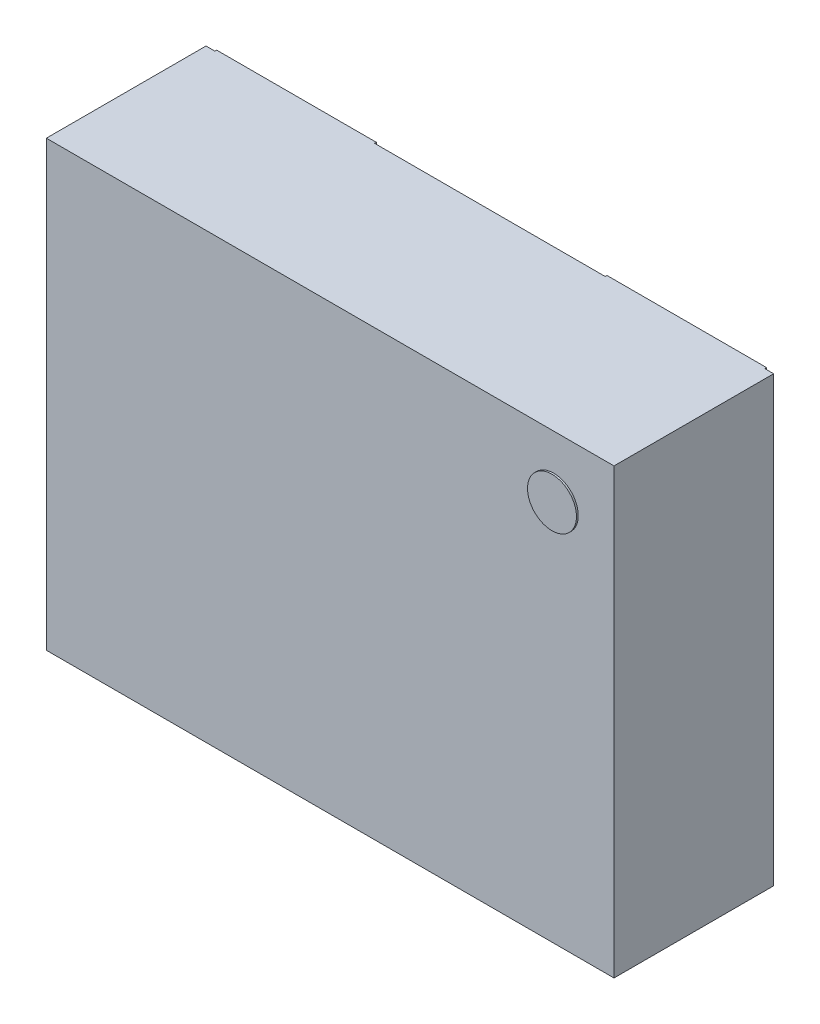
ISO-10303-21;
HEADER;
FILE_DESCRIPTION(('STEP AP214'),'2;1');
FILE_NAME('part.step','',(''),(''),'','','');
FILE_SCHEMA(('AUTOMOTIVE_DESIGN { 1 0 10303 214 1 1 1 1 }'));
ENDSEC;
DATA;
#1=APPLICATION_CONTEXT('core data for automotive mechanical design processes');
#2=APPLICATION_PROTOCOL_DEFINITION('international standard','automotive_design',2000,#1);
#3=PRODUCT_CONTEXT('',#1,'mechanical');
#4=PRODUCT('Part','Part','',(#3));
#5=PRODUCT_RELATED_PRODUCT_CATEGORY('part','',(#4));
#6=PRODUCT_DEFINITION_FORMATION('','',#4);
#7=PRODUCT_DEFINITION_CONTEXT('part definition',#1,'design');
#8=PRODUCT_DEFINITION('design','',#6,#7);
#9=PRODUCT_DEFINITION_SHAPE('','',#8);
#10=(LENGTH_UNIT() NAMED_UNIT(*) SI_UNIT(.MILLI.,.METRE.));
#11=(NAMED_UNIT(*) PLANE_ANGLE_UNIT() SI_UNIT($,.RADIAN.));
#12=(NAMED_UNIT(*) SI_UNIT($,.STERADIAN.) SOLID_ANGLE_UNIT());
#13=UNCERTAINTY_MEASURE_WITH_UNIT(LENGTH_MEASURE(1.E-05),#10,'distance_accuracy_value','');
#14=(GEOMETRIC_REPRESENTATION_CONTEXT(3) GLOBAL_UNCERTAINTY_ASSIGNED_CONTEXT((#13)) GLOBAL_UNIT_ASSIGNED_CONTEXT((#10,
#11,#12)) REPRESENTATION_CONTEXT('',''));
#15=CARTESIAN_POINT('',(0.,0.,0.));
#16=DIRECTION('',(0.,0.,1.));
#17=DIRECTION('',(1.,0.,0.));
#18=AXIS2_PLACEMENT_3D('',#15,#16,#17);
#19=CARTESIAN_POINT('',(7.35489990234375,20.14,-0.01));
#20=DIRECTION('',(0.,-1.,0.));
#21=DIRECTION('',(1.,0.,0.));
#22=AXIS2_PLACEMENT_3D('',#19,#20,#21);
#23=PLANE('',#22);
#24=DIRECTION('',(0.,0.,1.));
#25=VECTOR('',#24,1.);
#26=CARTESIAN_POINT('',(7.35489990234375,20.14,-0.0100000000000001));
#27=LINE('',#26,#25);
#28=CARTESIAN_POINT('',(7.35489990234375,20.14,0.));
#29=VERTEX_POINT('',#28);
#30=CARTESIAN_POINT('',(7.35489990234375,20.14,-0.01));
#31=VERTEX_POINT('',#30);
#32=EDGE_CURVE('E168',#29,#31,#27,.F.);
#33=ORIENTED_EDGE('',*,*,#32,.T.);
#34=DIRECTION('',(1.,0.,0.));
#35=VECTOR('',#34,1.);
#36=CARTESIAN_POINT('',(6.45489990234375,20.14,-0.0100000000000001));
#37=LINE('',#36,#35);
#38=CARTESIAN_POINT('',(6.45489990234375,20.14,-0.0100000000000001));
#39=VERTEX_POINT('',#38);
#40=EDGE_CURVE('E158',#39,#31,#37,.T.);
#41=ORIENTED_EDGE('',*,*,#40,.F.);
#42=DIRECTION('',(0.,0.,1.));
#43=VECTOR('',#42,1.);
#44=CARTESIAN_POINT('',(6.45489990234375,20.14,-0.0100000000000001));
#45=LINE('',#44,#43);
#46=CARTESIAN_POINT('',(6.45489990234375,20.14,0.));
#47=VERTEX_POINT('',#46);
#48=EDGE_CURVE('E181',#39,#47,#45,.T.);
#49=ORIENTED_EDGE('',*,*,#48,.T.);
#50=DIRECTION('',(1.,0.,0.));
#51=VECTOR('',#50,1.);
#52=CARTESIAN_POINT('',(7.40489990234374,20.14,0.));
#53=LINE('',#52,#51);
#54=EDGE_CURVE('E171',#29,#47,#53,.F.);
#55=ORIENTED_EDGE('',*,*,#54,.F.);
#56=EDGE_LOOP('',(#33,#41,#49,#55));
#57=FACE_BOUND('',#56,.T.);
#58=ADVANCED_FACE('F17',(#57),#23,.F.);
#59=CARTESIAN_POINT('',(4.25489990234375,20.14,-0.01));
#60=DIRECTION('',(0.,-1.,0.));
#61=DIRECTION('',(1.,0.,0.));
#62=AXIS2_PLACEMENT_3D('',#59,#60,#61);
#63=PLANE('',#62);
#64=DIRECTION('',(0.,0.,1.));
#65=VECTOR('',#64,1.);
#66=CARTESIAN_POINT('',(5.15489990234375,20.14,-0.0100000000000001));
#67=LINE('',#66,#65);
#68=CARTESIAN_POINT('',(5.15489990234375,20.14,0.));
#69=VERTEX_POINT('',#68);
#70=CARTESIAN_POINT('',(5.15489990234375,20.14,-0.01));
#71=VERTEX_POINT('',#70);
#72=EDGE_CURVE('E264',#69,#71,#67,.F.);
#73=ORIENTED_EDGE('',*,*,#72,.T.);
#74=DIRECTION('',(1.,0.,0.));
#75=VECTOR('',#74,1.);
#76=CARTESIAN_POINT('',(4.25489990234375,20.14,-0.01));
#77=LINE('',#76,#75);
#78=CARTESIAN_POINT('',(4.25489990234375,20.14,-0.01));
#79=VERTEX_POINT('',#78);
#80=EDGE_CURVE('E262',#79,#71,#77,.T.);
#81=ORIENTED_EDGE('',*,*,#80,.F.);
#82=DIRECTION('',(0.,0.,1.));
#83=VECTOR('',#82,1.);
#84=CARTESIAN_POINT('',(4.25489990234375,20.14,-0.0100000000000001));
#85=LINE('',#84,#83);
#86=CARTESIAN_POINT('',(4.25489990234375,20.14,0.));
#87=VERTEX_POINT('',#86);
#88=EDGE_CURVE('E254',#79,#87,#85,.T.);
#89=ORIENTED_EDGE('',*,*,#88,.T.);
#90=DIRECTION('',(1.,0.,0.));
#91=VECTOR('',#90,1.);
#92=CARTESIAN_POINT('',(7.40489990234374,20.14,0.));
#93=LINE('',#92,#91);
#94=EDGE_CURVE('E222',#69,#87,#93,.F.);
#95=ORIENTED_EDGE('',*,*,#94,.F.);
#96=EDGE_LOOP('',(#73,#81,#89,#95));
#97=FACE_BOUND('',#96,.T.);
#98=ADVANCED_FACE('F357',(#97),#63,.F.);
#99=CARTESIAN_POINT('',(4.25489990234375,21.04,-0.00999999999999997));
#100=DIRECTION('',(0.,1.,0.));
#101=DIRECTION('',(-1.,0.,0.));
#102=AXIS2_PLACEMENT_3D('',#99,#100,#101);
#103=PLANE('',#102);
#104=DIRECTION('',(0.,0.,1.));
#105=VECTOR('',#104,1.);
#106=CARTESIAN_POINT('',(4.25489990234375,21.04,-0.00999999999999992));
#107=LINE('',#106,#105);
#108=CARTESIAN_POINT('',(4.25489990234375,21.04,0.));
#109=VERTEX_POINT('',#108);
#110=CARTESIAN_POINT('',(4.25489990234375,21.04,-0.00999999999999997));
#111=VERTEX_POINT('',#110);
#112=EDGE_CURVE('E251',#109,#111,#107,.F.);
#113=ORIENTED_EDGE('',*,*,#112,.T.);
#114=DIRECTION('',(1.,0.,0.));
#115=VECTOR('',#114,1.);
#116=CARTESIAN_POINT('',(5.15489990234375,21.04,-0.00999999999999997));
#117=LINE('',#116,#115);
#118=CARTESIAN_POINT('',(5.15489990234375,21.04,-0.00999999999999996));
#119=VERTEX_POINT('',#118);
#120=EDGE_CURVE('E249',#119,#111,#117,.F.);
#121=ORIENTED_EDGE('',*,*,#120,.F.);
#122=DIRECTION('',(0.,0.,1.));
#123=VECTOR('',#122,1.);
#124=CARTESIAN_POINT('',(5.15489990234375,21.04,-0.00999999999999992));
#125=LINE('',#124,#123);
#126=CARTESIAN_POINT('',(5.15489990234375,21.04,0.));
#127=VERTEX_POINT('',#126);
#128=EDGE_CURVE('E241',#119,#127,#125,.T.);
#129=ORIENTED_EDGE('',*,*,#128,.T.);
#130=DIRECTION('',(1.,0.,0.));
#131=VECTOR('',#130,1.);
#132=CARTESIAN_POINT('',(7.40489990234374,21.04,0.));
#133=LINE('',#132,#131);
#134=EDGE_CURVE('E215',#109,#127,#133,.T.);
#135=ORIENTED_EDGE('',*,*,#134,.F.);
#136=EDGE_LOOP('',(#113,#121,#129,#135));
#137=FACE_BOUND('',#136,.T.);
#138=ADVANCED_FACE('F384',(#137),#103,.F.);
#139=CARTESIAN_POINT('',(6.90489990234375,21.04,-0.00999999999999997));
#140=DIRECTION('',(0.,1.,0.));
#141=DIRECTION('',(0.,0.,1.));
#142=AXIS2_PLACEMENT_3D('',#139,#140,#141);
#143=PLANE('',#142);
#144=DIRECTION('',(0.,0.,1.));
#145=VECTOR('',#144,1.);
#146=CARTESIAN_POINT('',(6.45489990234375,21.04,-0.00999999999999992));
#147=LINE('',#146,#145);
#148=CARTESIAN_POINT('',(6.45489990234375,21.04,0.));
#149=VERTEX_POINT('',#148);
#150=CARTESIAN_POINT('',(6.45489990234375,21.04,-0.00999999999999997));
#151=VERTEX_POINT('',#150);
#152=EDGE_CURVE('E239',#149,#151,#147,.F.);
#153=ORIENTED_EDGE('',*,*,#152,.T.);
#154=DIRECTION('',(1.,0.,0.));
#155=VECTOR('',#154,1.);
#156=CARTESIAN_POINT('',(7.35489990234375,21.04,-0.00999999999999997));
#157=LINE('',#156,#155);
#158=CARTESIAN_POINT('',(6.90489990234375,21.04,-0.00999999999999996));
#159=VERTEX_POINT('',#158);
#160=EDGE_CURVE('E193',#159,#151,#157,.F.);
#161=ORIENTED_EDGE('',*,*,#160,.F.);
#162=DIRECTION('',(0.,0.,1.));
#163=VECTOR('',#162,1.);
#164=CARTESIAN_POINT('',(6.90489990234375,21.04,-0.00999999999999995));
#165=LINE('',#164,#163);
#166=CARTESIAN_POINT('',(6.90489990234375,21.04,0.));
#167=VERTEX_POINT('',#166);
#168=EDGE_CURVE('E174',#159,#167,#165,.T.);
#169=ORIENTED_EDGE('',*,*,#168,.T.);
#170=DIRECTION('',(1.,0.,0.));
#171=VECTOR('',#170,1.);
#172=CARTESIAN_POINT('',(7.40489990234374,21.04,0.));
#173=LINE('',#172,#171);
#174=EDGE_CURVE('E192',#149,#167,#173,.T.);
#175=ORIENTED_EDGE('',*,*,#174,.F.);
#176=EDGE_LOOP('',(#153,#161,#169,#175));
#177=FACE_BOUND('',#176,.T.);
#178=ADVANCED_FACE('F191',(#177),#143,.F.);
#179=CARTESIAN_POINT('',(7.35489990234375,21.44,-0.00999999999999995));
#180=DIRECTION('',(-0.66436383882992,0.74740931868366,0.));
#181=DIRECTION('',(-0.74740931868366,-0.66436383882992,0.));
#182=AXIS2_PLACEMENT_3D('',#179,#180,#181);
#183=PLANE('',#182);
#184=ORIENTED_EDGE('',*,*,#168,.F.);
#185=DIRECTION('',(-0.747409318683659,-0.664363838829921,0.));
#186=VECTOR('',#185,1.);
#187=CARTESIAN_POINT('',(7.35489990234375,21.44,-0.00999999999999995));
#188=LINE('',#187,#186);
#189=CARTESIAN_POINT('',(7.35489990234375,21.44,-0.00999999999999994));
#190=VERTEX_POINT('',#189);
#191=EDGE_CURVE('E237',#190,#159,#188,.T.);
#192=ORIENTED_EDGE('',*,*,#191,.F.);
#193=DIRECTION('',(0.,0.,1.));
#194=VECTOR('',#193,1.);
#195=CARTESIAN_POINT('',(7.35489990234375,21.44,-0.00999999999999992));
#196=LINE('',#195,#194);
#197=CARTESIAN_POINT('',(7.35489990234375,21.44,0.));
#198=VERTEX_POINT('',#197);
#199=EDGE_CURVE('E200',#190,#198,#196,.T.);
#200=ORIENTED_EDGE('',*,*,#199,.T.);
#201=DIRECTION('',(0.747409318683659,0.664363838829921,0.));
#202=VECTOR('',#201,1.);
#203=CARTESIAN_POINT('',(6.90489990234375,21.04,0.));
#204=LINE('',#203,#202);
#205=EDGE_CURVE('E197',#167,#198,#204,.T.);
#206=ORIENTED_EDGE('',*,*,#205,.F.);
#207=EDGE_LOOP('',(#184,#192,#200,#206));
#208=FACE_BOUND('',#207,.T.);
#209=ADVANCED_FACE('F198',(#208),#183,.F.);
#210=CARTESIAN_POINT('',(7.35489990234375,19.34,-0.0100000000000001));
#211=DIRECTION('',(-1.,0.,0.));
#212=DIRECTION('',(0.,-1.,0.));
#213=AXIS2_PLACEMENT_3D('',#210,#211,#212);
#214=PLANE('',#213);
#215=DIRECTION('',(0.,0.,1.));
#216=VECTOR('',#215,1.);
#217=CARTESIAN_POINT('',(7.35489990234375,19.34,0.9));
#218=LINE('',#217,#216);
#219=CARTESIAN_POINT('',(7.35489990234375,19.34,0.));
#220=VERTEX_POINT('',#219);
#221=CARTESIAN_POINT('',(7.35489990234375,19.34,-0.0100000000000001));
#222=VERTEX_POINT('',#221);
#223=EDGE_CURVE('E179',#220,#222,#218,.F.);
#224=ORIENTED_EDGE('',*,*,#223,.T.);
#225=DIRECTION('',(0.,1.,0.));
#226=VECTOR('',#225,1.);
#227=CARTESIAN_POINT('',(7.35489990234375,19.34,-0.0100000000000001));
#228=LINE('',#227,#226);
#229=EDGE_CURVE('E165',#31,#222,#228,.F.);
#230=ORIENTED_EDGE('',*,*,#229,.F.);
#231=ORIENTED_EDGE('',*,*,#32,.F.);
#232=DIRECTION('',(0.,1.,0.));
#233=VECTOR('',#232,1.);
#234=CARTESIAN_POINT('',(7.35489990234375,21.84,0.));
#235=LINE('',#234,#233);
#236=EDGE_CURVE('E205',#220,#29,#235,.T.);
#237=ORIENTED_EDGE('',*,*,#236,.F.);
#238=EDGE_LOOP('',(#224,#230,#231,#237));
#239=FACE_BOUND('',#238,.T.);
#240=ADVANCED_FACE('F177',(#239),#214,.F.);
#241=CARTESIAN_POINT('',(6.45489990234375,19.34,-0.0100000000000001));
#242=DIRECTION('',(0.,0.,-1.));
#243=DIRECTION('',(0.,1.,0.));
#244=AXIS2_PLACEMENT_3D('',#241,#242,#243);
#245=PLANE('',#244);
#246=ORIENTED_EDGE('',*,*,#40,.T.);
#247=ORIENTED_EDGE('',*,*,#229,.T.);
#248=DIRECTION('',(-1.,0.,0.));
#249=VECTOR('',#248,1.);
#250=CARTESIAN_POINT('',(4.20489990234374,19.34,-0.0100000000000001));
#251=LINE('',#250,#249);
#252=CARTESIAN_POINT('',(6.45489990234375,19.34,-0.0100000000000001));
#253=VERTEX_POINT('',#252);
#254=EDGE_CURVE('E287',#222,#253,#251,.T.);
#255=ORIENTED_EDGE('',*,*,#254,.T.);
#256=DIRECTION('',(0.,1.,0.));
#257=VECTOR('',#256,1.);
#258=CARTESIAN_POINT('',(6.45489990234375,19.34,-0.0100000000000001));
#259=LINE('',#258,#257);
#260=EDGE_CURVE('E167',#253,#39,#259,.T.);
#261=ORIENTED_EDGE('',*,*,#260,.T.);
#262=EDGE_LOOP('',(#246,#247,#255,#261));
#263=FACE_BOUND('',#262,.T.);
#264=ADVANCED_FACE('F162',(#263),#245,.T.);
#265=CARTESIAN_POINT('',(6.45489990234375,19.34,-0.0100000000000001));
#266=DIRECTION('',(1.,0.,0.));
#267=DIRECTION('',(0.,1.,0.));
#268=AXIS2_PLACEMENT_3D('',#265,#266,#267);
#269=PLANE('',#268);
#270=ORIENTED_EDGE('',*,*,#48,.F.);
#271=ORIENTED_EDGE('',*,*,#260,.F.);
#272=DIRECTION('',(0.,0.,1.));
#273=VECTOR('',#272,1.);
#274=CARTESIAN_POINT('',(6.45489990234375,19.34,0.9));
#275=LINE('',#274,#273);
#276=CARTESIAN_POINT('',(6.45489990234375,19.34,0.));
#277=VERTEX_POINT('',#276);
#278=EDGE_CURVE('E271',#253,#277,#275,.T.);
#279=ORIENTED_EDGE('',*,*,#278,.T.);
#280=DIRECTION('',(0.,1.,0.));
#281=VECTOR('',#280,1.);
#282=CARTESIAN_POINT('',(6.45489990234375,21.84,0.));
#283=LINE('',#282,#281);
#284=EDGE_CURVE('E227',#47,#277,#283,.F.);
#285=ORIENTED_EDGE('',*,*,#284,.F.);
#286=EDGE_LOOP('',(#270,#271,#279,#285));
#287=FACE_BOUND('',#286,.T.);
#288=ADVANCED_FACE('F269',(#287),#269,.F.);
#289=CARTESIAN_POINT('',(5.15489990234375,19.34,-0.0100000000000001));
#290=DIRECTION('',(-1.,0.,0.));
#291=DIRECTION('',(0.,-1.,0.));
#292=AXIS2_PLACEMENT_3D('',#289,#290,#291);
#293=PLANE('',#292);
#294=DIRECTION('',(0.,0.,1.));
#295=VECTOR('',#294,1.);
#296=CARTESIAN_POINT('',(5.15489990234375,19.34,0.9));
#297=LINE('',#296,#295);
#298=CARTESIAN_POINT('',(5.15489990234375,19.34,0.));
#299=VERTEX_POINT('',#298);
#300=CARTESIAN_POINT('',(5.15489990234375,19.34,-0.01));
#301=VERTEX_POINT('',#300);
#302=EDGE_CURVE('E283',#299,#301,#297,.F.);
#303=ORIENTED_EDGE('',*,*,#302,.T.);
#304=DIRECTION('',(0.,1.,0.));
#305=VECTOR('',#304,1.);
#306=CARTESIAN_POINT('',(5.15489990234375,20.14,-0.01));
#307=LINE('',#306,#305);
#308=EDGE_CURVE('E260',#71,#301,#307,.F.);
#309=ORIENTED_EDGE('',*,*,#308,.F.);
#310=ORIENTED_EDGE('',*,*,#72,.F.);
#311=DIRECTION('',(0.,1.,0.));
#312=VECTOR('',#311,1.);
#313=CARTESIAN_POINT('',(5.15489990234375,21.84,0.));
#314=LINE('',#313,#312);
#315=EDGE_CURVE('E224',#299,#69,#314,.T.);
#316=ORIENTED_EDGE('',*,*,#315,.F.);
#317=EDGE_LOOP('',(#303,#309,#310,#316));
#318=FACE_BOUND('',#317,.T.);
#319=ADVANCED_FACE('F354',(#318),#293,.F.);
#320=CARTESIAN_POINT('',(4.25489990234375,20.14,-0.01));
#321=DIRECTION('',(0.,0.,-1.));
#322=DIRECTION('',(0.,1.,0.));
#323=AXIS2_PLACEMENT_3D('',#320,#321,#322);
#324=PLANE('',#323);
#325=ORIENTED_EDGE('',*,*,#308,.T.);
#326=DIRECTION('',(-1.,0.,0.));
#327=VECTOR('',#326,1.);
#328=CARTESIAN_POINT('',(4.20489990234374,19.34,-0.0100000000000001));
#329=LINE('',#328,#327);
#330=CARTESIAN_POINT('',(4.25489990234375,19.34,-0.0100000000000001));
#331=VERTEX_POINT('',#330);
#332=EDGE_CURVE('E285',#301,#331,#329,.T.);
#333=ORIENTED_EDGE('',*,*,#332,.T.);
#334=DIRECTION('',(0.,1.,0.));
#335=VECTOR('',#334,1.);
#336=CARTESIAN_POINT('',(4.25489990234375,19.34,-0.0100000000000001));
#337=LINE('',#336,#335);
#338=EDGE_CURVE('E257',#331,#79,#337,.T.);
#339=ORIENTED_EDGE('',*,*,#338,.T.);
#340=ORIENTED_EDGE('',*,*,#80,.T.);
#341=EDGE_LOOP('',(#325,#333,#339,#340));
#342=FACE_BOUND('',#341,.T.);
#343=ADVANCED_FACE('F350',(#342),#324,.T.);
#344=CARTESIAN_POINT('',(4.25489990234375,19.34,-0.0100000000000001));
#345=DIRECTION('',(1.,0.,0.));
#346=DIRECTION('',(0.,1.,0.));
#347=AXIS2_PLACEMENT_3D('',#344,#345,#346);
#348=PLANE('',#347);
#349=ORIENTED_EDGE('',*,*,#88,.F.);
#350=ORIENTED_EDGE('',*,*,#338,.F.);
#351=DIRECTION('',(0.,0.,1.));
#352=VECTOR('',#351,1.);
#353=CARTESIAN_POINT('',(4.25489990234375,19.34,0.9));
#354=LINE('',#353,#352);
#355=CARTESIAN_POINT('',(4.25489990234375,19.34,0.));
#356=VERTEX_POINT('',#355);
#357=EDGE_CURVE('E346',#331,#356,#354,.T.);
#358=ORIENTED_EDGE('',*,*,#357,.T.);
#359=DIRECTION('',(0.,1.,0.));
#360=VECTOR('',#359,1.);
#361=CARTESIAN_POINT('',(4.25489990234375,21.84,0.));
#362=LINE('',#361,#360);
#363=EDGE_CURVE('E220',#87,#356,#362,.F.);
#364=ORIENTED_EDGE('',*,*,#363,.F.);
#365=EDGE_LOOP('',(#349,#350,#358,#364));
#366=FACE_BOUND('',#365,.T.);
#367=ADVANCED_FACE('F361',(#366),#348,.F.);
#368=CARTESIAN_POINT('',(4.25489990234375,21.84,-0.00999999999999992));
#369=DIRECTION('',(1.,0.,0.));
#370=DIRECTION('',(0.,1.,0.));
#371=AXIS2_PLACEMENT_3D('',#368,#369,#370);
#372=PLANE('',#371);
#373=DIRECTION('',(0.,0.,1.));
#374=VECTOR('',#373,1.);
#375=CARTESIAN_POINT('',(4.25489990234375,21.84,0.9));
#376=LINE('',#375,#374);
#377=CARTESIAN_POINT('',(4.25489990234375,21.84,0.));
#378=VERTEX_POINT('',#377);
#379=CARTESIAN_POINT('',(4.25489990234375,21.84,-0.00999999999999994));
#380=VERTEX_POINT('',#379);
#381=EDGE_CURVE('E330',#378,#380,#376,.F.);
#382=ORIENTED_EDGE('',*,*,#381,.T.);
#383=DIRECTION('',(0.,1.,0.));
#384=VECTOR('',#383,1.);
#385=CARTESIAN_POINT('',(4.25489990234375,21.84,-0.00999999999999992));
#386=LINE('',#385,#384);
#387=EDGE_CURVE('E247',#111,#380,#386,.T.);
#388=ORIENTED_EDGE('',*,*,#387,.F.);
#389=ORIENTED_EDGE('',*,*,#112,.F.);
#390=DIRECTION('',(0.,1.,0.));
#391=VECTOR('',#390,1.);
#392=CARTESIAN_POINT('',(4.25489990234375,21.84,0.));
#393=LINE('',#392,#391);
#394=EDGE_CURVE('E217',#378,#109,#393,.F.);
#395=ORIENTED_EDGE('',*,*,#394,.F.);
#396=EDGE_LOOP('',(#382,#388,#389,#395));
#397=FACE_BOUND('',#396,.T.);
#398=ADVANCED_FACE('F572',(#397),#372,.F.);
#399=CARTESIAN_POINT('',(5.15489990234375,21.84,-0.00999999999999992));
#400=DIRECTION('',(0.,0.,-1.));
#401=DIRECTION('',(0.,1.,0.));
#402=AXIS2_PLACEMENT_3D('',#399,#400,#401);
#403=PLANE('',#402);
#404=ORIENTED_EDGE('',*,*,#120,.T.);
#405=ORIENTED_EDGE('',*,*,#387,.T.);
#406=DIRECTION('',(1.,0.,0.));
#407=VECTOR('',#406,1.);
#408=CARTESIAN_POINT('',(4.20489990234374,21.84,-0.00999999999999992));
#409=LINE('',#408,#407);
#410=CARTESIAN_POINT('',(5.15489990234375,21.84,-0.00999999999999992));
#411=VERTEX_POINT('',#410);
#412=EDGE_CURVE('E327',#380,#411,#409,.T.);
#413=ORIENTED_EDGE('',*,*,#412,.T.);
#414=DIRECTION('',(0.,-1.,0.));
#415=VECTOR('',#414,1.);
#416=CARTESIAN_POINT('',(5.15489990234375,21.84,-0.00999999999999992));
#417=LINE('',#416,#415);
#418=EDGE_CURVE('E244',#411,#119,#417,.T.);
#419=ORIENTED_EDGE('',*,*,#418,.T.);
#420=EDGE_LOOP('',(#404,#405,#413,#419));
#421=FACE_BOUND('',#420,.T.);
#422=ADVANCED_FACE('F582',(#421),#403,.T.);
#423=CARTESIAN_POINT('',(5.15489990234375,21.84,-0.00999999999999992));
#424=DIRECTION('',(-1.,0.,0.));
#425=DIRECTION('',(0.,-1.,0.));
#426=AXIS2_PLACEMENT_3D('',#423,#424,#425);
#427=PLANE('',#426);
#428=ORIENTED_EDGE('',*,*,#128,.F.);
#429=ORIENTED_EDGE('',*,*,#418,.F.);
#430=DIRECTION('',(0.,0.,1.));
#431=VECTOR('',#430,1.);
#432=CARTESIAN_POINT('',(5.15489990234375,21.84,0.9));
#433=LINE('',#432,#431);
#434=CARTESIAN_POINT('',(5.15489990234375,21.84,0.));
#435=VERTEX_POINT('',#434);
#436=EDGE_CURVE('E324',#411,#435,#433,.T.);
#437=ORIENTED_EDGE('',*,*,#436,.T.);
#438=DIRECTION('',(0.,1.,0.));
#439=VECTOR('',#438,1.);
#440=CARTESIAN_POINT('',(5.15489990234375,21.84,0.));
#441=LINE('',#440,#439);
#442=EDGE_CURVE('E213',#127,#435,#441,.T.);
#443=ORIENTED_EDGE('',*,*,#442,.F.);
#444=EDGE_LOOP('',(#428,#429,#437,#443));
#445=FACE_BOUND('',#444,.T.);
#446=ADVANCED_FACE('F389',(#445),#427,.F.);
#447=CARTESIAN_POINT('',(6.45489990234375,21.84,-0.00999999999999992));
#448=DIRECTION('',(1.,0.,0.));
#449=DIRECTION('',(0.,1.,0.));
#450=AXIS2_PLACEMENT_3D('',#447,#448,#449);
#451=PLANE('',#450);
#452=DIRECTION('',(0.,0.,1.));
#453=VECTOR('',#452,1.);
#454=CARTESIAN_POINT('',(6.45489990234375,21.84,0.9));
#455=LINE('',#454,#453);
#456=CARTESIAN_POINT('',(6.45489990234375,21.84,0.));
#457=VERTEX_POINT('',#456);
#458=CARTESIAN_POINT('',(6.45489990234375,21.84,-0.00999999999999994));
#459=VERTEX_POINT('',#458);
#460=EDGE_CURVE('E318',#457,#459,#455,.F.);
#461=ORIENTED_EDGE('',*,*,#460,.T.);
#462=DIRECTION('',(0.,1.,0.));
#463=VECTOR('',#462,1.);
#464=CARTESIAN_POINT('',(6.45489990234375,21.04,-0.00999999999999997));
#465=LINE('',#464,#463);
#466=EDGE_CURVE('E234',#151,#459,#465,.T.);
#467=ORIENTED_EDGE('',*,*,#466,.F.);
#468=ORIENTED_EDGE('',*,*,#152,.F.);
#469=DIRECTION('',(0.,1.,0.));
#470=VECTOR('',#469,1.);
#471=CARTESIAN_POINT('',(6.45489990234375,21.84,0.));
#472=LINE('',#471,#470);
#473=EDGE_CURVE('E207',#457,#149,#472,.F.);
#474=ORIENTED_EDGE('',*,*,#473,.F.);
#475=EDGE_LOOP('',(#461,#467,#468,#474));
#476=FACE_BOUND('',#475,.T.);
#477=ADVANCED_FACE('F396',(#476),#451,.F.);
#478=CARTESIAN_POINT('',(7.35489990234375,21.04,-0.00999999999999997));
#479=DIRECTION('',(0.,0.,-1.));
#480=DIRECTION('',(0.,1.,0.));
#481=AXIS2_PLACEMENT_3D('',#478,#479,#480);
#482=PLANE('',#481);
#483=ORIENTED_EDGE('',*,*,#466,.T.);
#484=DIRECTION('',(1.,0.,0.));
#485=VECTOR('',#484,1.);
#486=CARTESIAN_POINT('',(4.20489990234374,21.84,-0.00999999999999992));
#487=LINE('',#486,#485);
#488=CARTESIAN_POINT('',(7.35489990234375,21.84,-0.00999999999999992));
#489=VERTEX_POINT('',#488);
#490=EDGE_CURVE('E315',#459,#489,#487,.T.);
#491=ORIENTED_EDGE('',*,*,#490,.T.);
#492=DIRECTION('',(0.,-1.,0.));
#493=VECTOR('',#492,1.);
#494=CARTESIAN_POINT('',(7.35489990234375,21.84,-0.00999999999999992));
#495=LINE('',#494,#493);
#496=EDGE_CURVE('E231',#489,#190,#495,.T.);
#497=ORIENTED_EDGE('',*,*,#496,.T.);
#498=ORIENTED_EDGE('',*,*,#191,.T.);
#499=ORIENTED_EDGE('',*,*,#160,.T.);
#500=EDGE_LOOP('',(#483,#491,#497,#498,#499));
#501=FACE_BOUND('',#500,.T.);
#502=ADVANCED_FACE('F398',(#501),#482,.T.);
#503=CARTESIAN_POINT('',(7.35489990234375,21.84,-0.00999999999999992));
#504=DIRECTION('',(-1.,0.,0.));
#505=DIRECTION('',(0.,-1.,0.));
#506=AXIS2_PLACEMENT_3D('',#503,#504,#505);
#507=PLANE('',#506);
#508=ORIENTED_EDGE('',*,*,#199,.F.);
#509=ORIENTED_EDGE('',*,*,#496,.F.);
#510=DIRECTION('',(0.,0.,1.));
#511=VECTOR('',#510,1.);
#512=CARTESIAN_POINT('',(7.35489990234375,21.84,0.9));
#513=LINE('',#512,#511);
#514=CARTESIAN_POINT('',(7.35489990234375,21.84,0.));
#515=VERTEX_POINT('',#514);
#516=EDGE_CURVE('E312',#489,#515,#513,.T.);
#517=ORIENTED_EDGE('',*,*,#516,.T.);
#518=DIRECTION('',(0.,1.,0.));
#519=VECTOR('',#518,1.);
#520=CARTESIAN_POINT('',(7.35489990234375,21.84,0.));
#521=LINE('',#520,#519);
#522=EDGE_CURVE('E203',#198,#515,#521,.T.);
#523=ORIENTED_EDGE('',*,*,#522,.F.);
#524=EDGE_LOOP('',(#508,#509,#517,#523));
#525=FACE_BOUND('',#524,.T.);
#526=ADVANCED_FACE('F400',(#525),#507,.F.);
#527=CARTESIAN_POINT('',(7.40489990234374,21.84,0.));
#528=DIRECTION('',(0.,0.,-1.));
#529=DIRECTION('',(0.,1.,0.));
#530=AXIS2_PLACEMENT_3D('',#527,#528,#529);
#531=PLANE('',#530);
#532=DIRECTION('',(-1.,0.,0.));
#533=VECTOR('',#532,1.);
#534=CARTESIAN_POINT('',(4.20489990234374,19.34,0.));
#535=LINE('',#534,#533);
#536=CARTESIAN_POINT('',(7.40489990234374,19.34,0.));
#537=VERTEX_POINT('',#536);
#538=EDGE_CURVE('E293',#537,#220,#535,.T.);
#539=ORIENTED_EDGE('',*,*,#538,.T.);
#540=ORIENTED_EDGE('',*,*,#236,.T.);
#541=ORIENTED_EDGE('',*,*,#54,.T.);
#542=ORIENTED_EDGE('',*,*,#284,.T.);
#543=DIRECTION('',(-1.,0.,0.));
#544=VECTOR('',#543,1.);
#545=CARTESIAN_POINT('',(4.20489990234374,19.34,0.));
#546=LINE('',#545,#544);
#547=EDGE_CURVE('E276',#277,#299,#546,.T.);
#548=ORIENTED_EDGE('',*,*,#547,.T.);
#549=ORIENTED_EDGE('',*,*,#315,.T.);
#550=ORIENTED_EDGE('',*,*,#94,.T.);
#551=ORIENTED_EDGE('',*,*,#363,.T.);
#552=DIRECTION('',(-1.,0.,0.));
#553=VECTOR('',#552,1.);
#554=CARTESIAN_POINT('',(4.20489990234374,19.34,0.));
#555=LINE('',#554,#553);
#556=CARTESIAN_POINT('',(4.20489990234374,19.34,0.));
#557=VERTEX_POINT('',#556);
#558=EDGE_CURVE('E344',#356,#557,#555,.T.);
#559=ORIENTED_EDGE('',*,*,#558,.T.);
#560=DIRECTION('',(0.,1.,0.));
#561=VECTOR('',#560,1.);
#562=CARTESIAN_POINT('',(4.20489990234374,19.34,0.));
#563=LINE('',#562,#561);
#564=CARTESIAN_POINT('',(4.20489990234374,21.84,0.));
#565=VERTEX_POINT('',#564);
#566=EDGE_CURVE('E339',#557,#565,#563,.T.);
#567=ORIENTED_EDGE('',*,*,#566,.T.);
#568=DIRECTION('',(1.,0.,0.));
#569=VECTOR('',#568,1.);
#570=CARTESIAN_POINT('',(4.20489990234374,21.84,0.));
#571=LINE('',#570,#569);
#572=EDGE_CURVE('E333',#565,#378,#571,.T.);
#573=ORIENTED_EDGE('',*,*,#572,.T.);
#574=ORIENTED_EDGE('',*,*,#394,.T.);
#575=ORIENTED_EDGE('',*,*,#134,.T.);
#576=ORIENTED_EDGE('',*,*,#442,.T.);
#577=DIRECTION('',(1.,0.,0.));
#578=VECTOR('',#577,1.);
#579=CARTESIAN_POINT('',(4.20489990234374,21.84,0.));
#580=LINE('',#579,#578);
#581=EDGE_CURVE('E321',#435,#457,#580,.T.);
#582=ORIENTED_EDGE('',*,*,#581,.T.);
#583=ORIENTED_EDGE('',*,*,#473,.T.);
#584=ORIENTED_EDGE('',*,*,#174,.T.);
#585=ORIENTED_EDGE('',*,*,#205,.T.);
#586=ORIENTED_EDGE('',*,*,#522,.T.);
#587=DIRECTION('',(1.,0.,0.));
#588=VECTOR('',#587,1.);
#589=CARTESIAN_POINT('',(4.20489990234374,21.84,0.));
#590=LINE('',#589,#588);
#591=CARTESIAN_POINT('',(7.40489990234374,21.84,0.));
#592=VERTEX_POINT('',#591);
#593=EDGE_CURVE('E301',#515,#592,#590,.T.);
#594=ORIENTED_EDGE('',*,*,#593,.T.);
#595=DIRECTION('',(0.,-1.,0.));
#596=VECTOR('',#595,1.);
#597=CARTESIAN_POINT('',(7.40489990234374,19.34,0.));
#598=LINE('',#597,#596);
#599=EDGE_CURVE('E300',#592,#537,#598,.T.);
#600=ORIENTED_EDGE('',*,*,#599,.T.);
#601=EDGE_LOOP('',(#539,#540,#541,#542,#548,#549,#550,#551,#559,#567,#573,#574,#575,#576,#582,
#583,#584,#585,#586,#594,#600));
#602=FACE_BOUND('',#601,.T.);
#603=ADVANCED_FACE('F275',(#602),#531,.T.);
#604=CARTESIAN_POINT('',(7.06534117888643,21.4966894023846,0.91));
#605=DIRECTION('',(0.,0.,1.));
#606=DIRECTION('',(0.,-1.,0.));
#607=AXIS2_PLACEMENT_3D('',#604,#605,#606);
#608=PLANE('',#607);
#609=CARTESIAN_POINT('',(7.06534117888643,21.4966894023846,0.91));
#610=DIRECTION('',(0.,0.,1.));
#611=DIRECTION('',(0.,-1.,0.));
#612=AXIS2_PLACEMENT_3D('',#609,#610,#611);
#613=CIRCLE('',#612,0.137986424036285);
#614=CARTESIAN_POINT('',(7.06534117888643,21.3587029783483,0.91));
#615=VERTEX_POINT('',#614);
#616=EDGE_CURVE('E20',#615,#615,#613,.F.);
#617=ORIENTED_EDGE('',*,*,#616,.F.);
#618=EDGE_LOOP('',(#617));
#619=FACE_BOUND('',#618,.T.);
#620=ADVANCED_FACE('F408',(#619),#608,.T.);
#621=CARTESIAN_POINT('',(4.20489990234374,19.34,0.9));
#622=DIRECTION('',(0.,1.,0.));
#623=DIRECTION('',(-1.,0.,0.));
#624=AXIS2_PLACEMENT_3D('',#621,#622,#623);
#625=PLANE('',#624);
#626=ORIENTED_EDGE('',*,*,#357,.F.);
#627=ORIENTED_EDGE('',*,*,#332,.F.);
#628=ORIENTED_EDGE('',*,*,#302,.F.);
#629=ORIENTED_EDGE('',*,*,#547,.F.);
#630=ORIENTED_EDGE('',*,*,#278,.F.);
#631=ORIENTED_EDGE('',*,*,#254,.F.);
#632=ORIENTED_EDGE('',*,*,#223,.F.);
#633=ORIENTED_EDGE('',*,*,#538,.F.);
#634=DIRECTION('',(0.,0.,1.));
#635=VECTOR('',#634,1.);
#636=CARTESIAN_POINT('',(7.40489990234374,19.34,0.9));
#637=LINE('',#636,#635);
#638=CARTESIAN_POINT('',(7.40489990234374,19.34,0.9));
#639=VERTEX_POINT('',#638);
#640=EDGE_CURVE('E298',#537,#639,#637,.T.);
#641=ORIENTED_EDGE('',*,*,#640,.T.);
#642=DIRECTION('',(1.,0.,0.));
#643=VECTOR('',#642,1.);
#644=CARTESIAN_POINT('',(7.40489990234374,19.34,0.9));
#645=LINE('',#644,#643);
#646=CARTESIAN_POINT('',(4.20489990234374,19.34,0.9));
#647=VERTEX_POINT('',#646);
#648=EDGE_CURVE('E306',#639,#647,#645,.F.);
#649=ORIENTED_EDGE('',*,*,#648,.T.);
#650=DIRECTION('',(0.,0.,1.));
#651=VECTOR('',#650,1.);
#652=CARTESIAN_POINT('',(4.20489990234374,19.34,0.9));
#653=LINE('',#652,#651);
#654=EDGE_CURVE('E341',#647,#557,#653,.F.);
#655=ORIENTED_EDGE('',*,*,#654,.T.);
#656=ORIENTED_EDGE('',*,*,#558,.F.);
#657=EDGE_LOOP('',(#626,#627,#628,#629,#630,#631,#632,#633,#641,#649,#655,#656));
#658=FACE_BOUND('',#657,.T.);
#659=ADVANCED_FACE('F280',(#658),#625,.F.);
#660=CARTESIAN_POINT('',(4.20489990234374,19.34,0.9));
#661=DIRECTION('',(1.,0.,0.));
#662=DIRECTION('',(0.,1.,0.));
#663=AXIS2_PLACEMENT_3D('',#660,#661,#662);
#664=PLANE('',#663);
#665=ORIENTED_EDGE('',*,*,#654,.F.);
#666=DIRECTION('',(0.,1.,0.));
#667=VECTOR('',#666,1.);
#668=CARTESIAN_POINT('',(4.20489990234374,21.84,0.9));
#669=LINE('',#668,#667);
#670=CARTESIAN_POINT('',(4.20489990234374,21.84,0.9));
#671=VERTEX_POINT('',#670);
#672=EDGE_CURVE('E367',#647,#671,#669,.T.);
#673=ORIENTED_EDGE('',*,*,#672,.T.);
#674=DIRECTION('',(0.,0.,1.));
#675=VECTOR('',#674,1.);
#676=CARTESIAN_POINT('',(4.20489990234374,21.84,0.9));
#677=LINE('',#676,#675);
#678=EDGE_CURVE('E336',#671,#565,#677,.F.);
#679=ORIENTED_EDGE('',*,*,#678,.T.);
#680=ORIENTED_EDGE('',*,*,#566,.F.);
#681=EDGE_LOOP('',(#665,#673,#679,#680));
#682=FACE_BOUND('',#681,.T.);
#683=ADVANCED_FACE('F366',(#682),#664,.F.);
#684=CARTESIAN_POINT('',(4.20489990234374,21.84,0.9));
#685=DIRECTION('',(0.,-1.,0.));
#686=DIRECTION('',(1.,0.,0.));
#687=AXIS2_PLACEMENT_3D('',#684,#685,#686);
#688=PLANE('',#687);
#689=ORIENTED_EDGE('',*,*,#516,.F.);
#690=ORIENTED_EDGE('',*,*,#490,.F.);
#691=ORIENTED_EDGE('',*,*,#460,.F.);
#692=ORIENTED_EDGE('',*,*,#581,.F.);
#693=ORIENTED_EDGE('',*,*,#436,.F.);
#694=ORIENTED_EDGE('',*,*,#412,.F.);
#695=ORIENTED_EDGE('',*,*,#381,.F.);
#696=ORIENTED_EDGE('',*,*,#572,.F.);
#697=ORIENTED_EDGE('',*,*,#678,.F.);
#698=DIRECTION('',(1.,0.,0.));
#699=VECTOR('',#698,1.);
#700=CARTESIAN_POINT('',(7.40489990234374,21.84,0.9));
#701=LINE('',#700,#699);
#702=CARTESIAN_POINT('',(7.40489990234374,21.84,0.9));
#703=VERTEX_POINT('',#702);
#704=EDGE_CURVE('E372',#671,#703,#701,.T.);
#705=ORIENTED_EDGE('',*,*,#704,.T.);
#706=DIRECTION('',(0.,0.,1.));
#707=VECTOR('',#706,1.);
#708=CARTESIAN_POINT('',(7.40489990234374,21.84,0.9));
#709=LINE('',#708,#707);
#710=EDGE_CURVE('E34',#703,#592,#709,.F.);
#711=ORIENTED_EDGE('',*,*,#710,.T.);
#712=ORIENTED_EDGE('',*,*,#593,.F.);
#713=EDGE_LOOP('',(#689,#690,#691,#692,#693,#694,#695,#696,#697,#705,#711,#712));
#714=FACE_BOUND('',#713,.T.);
#715=ADVANCED_FACE('F377',(#714),#688,.F.);
#716=CARTESIAN_POINT('',(7.40489990234374,19.34,0.9));
#717=DIRECTION('',(-1.,0.,0.));
#718=DIRECTION('',(0.,-1.,0.));
#719=AXIS2_PLACEMENT_3D('',#716,#717,#718);
#720=PLANE('',#719);
#721=ORIENTED_EDGE('',*,*,#710,.F.);
#722=DIRECTION('',(0.,1.,0.));
#723=VECTOR('',#722,1.);
#724=CARTESIAN_POINT('',(7.40489990234374,21.84,0.9));
#725=LINE('',#724,#723);
#726=EDGE_CURVE('E26',#703,#639,#725,.F.);
#727=ORIENTED_EDGE('',*,*,#726,.T.);
#728=ORIENTED_EDGE('',*,*,#640,.F.);
#729=ORIENTED_EDGE('',*,*,#599,.F.);
#730=EDGE_LOOP('',(#721,#727,#728,#729));
#731=FACE_BOUND('',#730,.T.);
#732=ADVANCED_FACE('F299',(#731),#720,.F.);
#733=CARTESIAN_POINT('',(7.06534117888643,21.4966894023846,0.91));
#734=DIRECTION('',(0.,0.,1.));
#735=DIRECTION('',(0.,-1.,0.));
#736=AXIS2_PLACEMENT_3D('',#733,#734,#735);
#737=CYLINDRICAL_SURFACE('',#736,0.137986424036285);
#738=CARTESIAN_POINT('',(7.06534117888643,21.4966894023846,0.9));
#739=DIRECTION('',(0.,0.,1.));
#740=DIRECTION('',(0.,-1.,0.));
#741=AXIS2_PLACEMENT_3D('',#738,#739,#740);
#742=CIRCLE('',#741,0.137986424036285);
#743=CARTESIAN_POINT('',(7.06534117888643,21.3587029783483,0.9));
#744=VERTEX_POINT('',#743);
#745=EDGE_CURVE('E11',#744,#744,#742,.T.);
#746=ORIENTED_EDGE('',*,*,#745,.T.);
#747=EDGE_LOOP('',(#746));
#748=FACE_BOUND('',#747,.T.);
#749=ORIENTED_EDGE('',*,*,#616,.T.);
#750=EDGE_LOOP('',(#749));
#751=FACE_BOUND('',#750,.T.);
#752=ADVANCED_FACE('F412',(#748,#751),#737,.T.);
#753=CARTESIAN_POINT('',(7.40489990234374,21.84,0.9));
#754=DIRECTION('',(0.,0.,-1.));
#755=DIRECTION('',(0.,1.,0.));
#756=AXIS2_PLACEMENT_3D('',#753,#754,#755);
#757=PLANE('',#756);
#758=ORIENTED_EDGE('',*,*,#745,.F.);
#759=EDGE_LOOP('',(#758));
#760=FACE_BOUND('',#759,.T.);
#761=ORIENTED_EDGE('',*,*,#704,.F.);
#762=ORIENTED_EDGE('',*,*,#672,.F.);
#763=ORIENTED_EDGE('',*,*,#648,.F.);
#764=ORIENTED_EDGE('',*,*,#726,.F.);
#765=EDGE_LOOP('',(#761,#762,#763,#764));
#766=FACE_BOUND('',#765,.T.);
#767=ADVANCED_FACE('F370',(#760,#766),#757,.F.);
#768=CLOSED_SHELL('',(#58,#98,#138,#178,#209,#240,#264,#288,#319,#343,#367,#398,#422,#446,#477,
#502,#526,#603,#620,#659,#683,#715,#732,#752,#767));
#769=MANIFOLD_SOLID_BREP('B1',#768);
#770=ADVANCED_BREP_SHAPE_REPRESENTATION('',(#18,#769),#14);
#771=SHAPE_DEFINITION_REPRESENTATION(#9,#770);
ENDSEC;
END-ISO-10303-21;
